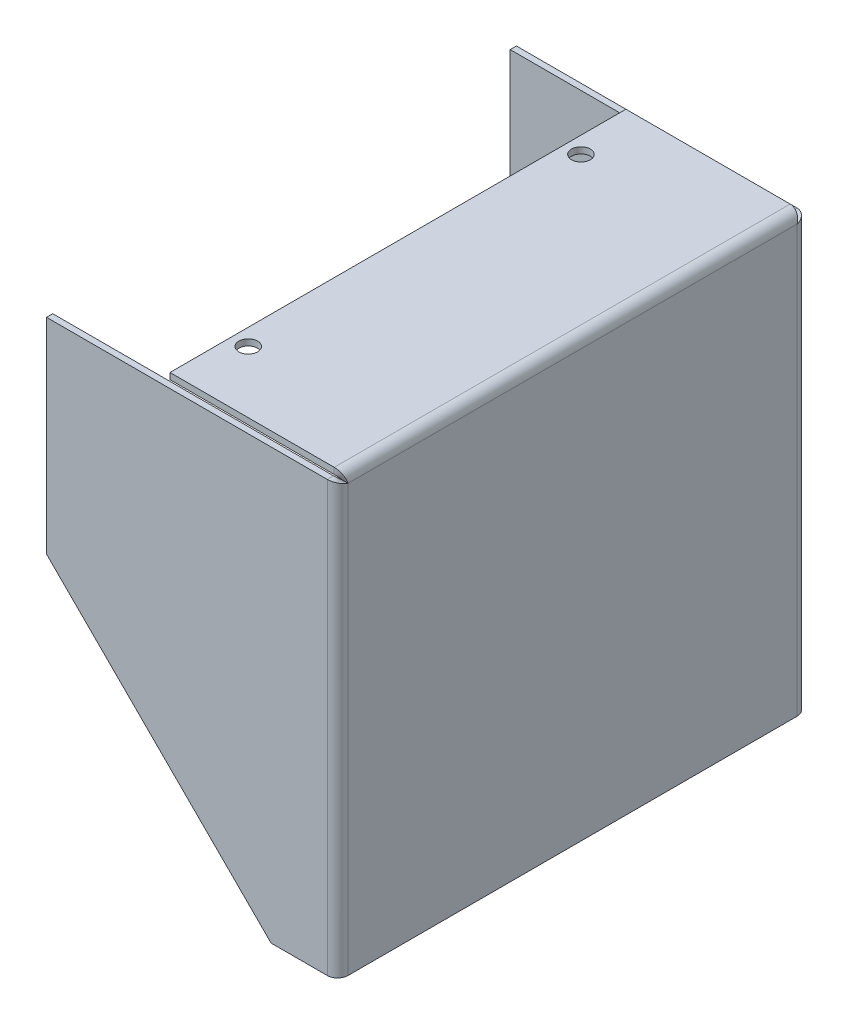
ISO-10303-21;
HEADER;
FILE_DESCRIPTION(('STEP AP214'),'2;1');
FILE_NAME('part.step','',(''),(''),'','','');
FILE_SCHEMA(('AUTOMOTIVE_DESIGN { 1 0 10303 214 1 1 1 1 }'));
ENDSEC;
DATA;
#1=APPLICATION_CONTEXT('core data for automotive mechanical design processes');
#2=APPLICATION_PROTOCOL_DEFINITION('international standard','automotive_design',2000,#1);
#3=PRODUCT_CONTEXT('',#1,'mechanical');
#4=PRODUCT('Part','Part','',(#3));
#5=PRODUCT_RELATED_PRODUCT_CATEGORY('part','',(#4));
#6=PRODUCT_DEFINITION_FORMATION('','',#4);
#7=PRODUCT_DEFINITION_CONTEXT('part definition',#1,'design');
#8=PRODUCT_DEFINITION('design','',#6,#7);
#9=PRODUCT_DEFINITION_SHAPE('','',#8);
#10=(LENGTH_UNIT() NAMED_UNIT(*) SI_UNIT(.MILLI.,.METRE.));
#11=(NAMED_UNIT(*) PLANE_ANGLE_UNIT() SI_UNIT($,.RADIAN.));
#12=(NAMED_UNIT(*) SI_UNIT($,.STERADIAN.) SOLID_ANGLE_UNIT());
#13=UNCERTAINTY_MEASURE_WITH_UNIT(LENGTH_MEASURE(1.E-05),#10,'distance_accuracy_value','');
#14=(GEOMETRIC_REPRESENTATION_CONTEXT(3) GLOBAL_UNCERTAINTY_ASSIGNED_CONTEXT((#13)) GLOBAL_UNIT_ASSIGNED_CONTEXT((#10,
#11,#12)) REPRESENTATION_CONTEXT('',''));
#15=CARTESIAN_POINT('',(0.,0.,0.));
#16=DIRECTION('',(0.,0.,1.));
#17=DIRECTION('',(1.,0.,0.));
#18=AXIS2_PLACEMENT_3D('',#15,#16,#17);
#19=CARTESIAN_POINT('',(-1.5,-52.5,56.5));
#20=DIRECTION('',(0.,-1.,0.));
#21=DIRECTION('',(0.,0.,-1.));
#22=AXIS2_PLACEMENT_3D('',#19,#20,#21);
#23=PLANE('',#22);
#24=DIRECTION('',(0.,0.,-1.));
#25=VECTOR('',#24,1.);
#26=CARTESIAN_POINT('',(-1.5,-52.5,56.5));
#27=LINE('',#26,#25);
#28=CARTESIAN_POINT('',(-1.5,-52.5000000000182,54.));
#29=VERTEX_POINT('',#28);
#30=CARTESIAN_POINT('',(-1.5,-52.5,-54.0000000000015));
#31=VERTEX_POINT('',#30);
#32=EDGE_CURVE('E272',#29,#31,#27,.T.);
#33=ORIENTED_EDGE('',*,*,#32,.T.);
#34=DIRECTION('',(1.,0.,0.));
#35=VECTOR('',#34,1.);
#36=CARTESIAN_POINT('',(0.,-52.5,-54.0000000000015));
#37=LINE('',#36,#35);
#38=CARTESIAN_POINT('',(0.,-52.5,-54.0000000000015));
#39=VERTEX_POINT('',#38);
#40=EDGE_CURVE('E515',#39,#31,#37,.F.);
#41=ORIENTED_EDGE('',*,*,#40,.F.);
#42=DIRECTION('',(0.,0.,-1.));
#43=VECTOR('',#42,1.);
#44=CARTESIAN_POINT('',(0.,-52.5,56.5));
#45=LINE('',#44,#43);
#46=CARTESIAN_POINT('',(0.,-52.5,54.));
#47=VERTEX_POINT('',#46);
#48=EDGE_CURVE('E269',#47,#39,#45,.T.);
#49=ORIENTED_EDGE('',*,*,#48,.F.);
#50=DIRECTION('',(1.,0.,0.));
#51=VECTOR('',#50,1.);
#52=CARTESIAN_POINT('',(0.,-52.5000000000182,54.));
#53=LINE('',#52,#51);
#54=EDGE_CURVE('E237',#47,#29,#53,.F.);
#55=ORIENTED_EDGE('',*,*,#54,.T.);
#56=EDGE_LOOP('',(#33,#41,#49,#55));
#57=FACE_BOUND('',#56,.T.);
#58=ADVANCED_FACE('F37',(#57),#23,.T.);
#59=CARTESIAN_POINT('',(-1.5,0.,0.));
#60=DIRECTION('',(-1.,0.,0.));
#61=DIRECTION('',(0.,0.,1.));
#62=AXIS2_PLACEMENT_3D('',#59,#60,#61);
#63=PLANE('',#62);
#64=DIRECTION('',(0.,0.,-1.));
#65=VECTOR('',#64,1.);
#66=CARTESIAN_POINT('',(-1.5,50.,56.5));
#67=LINE('',#66,#65);
#68=CARTESIAN_POINT('',(-1.5,49.9999999999863,54.));
#69=VERTEX_POINT('',#68);
#70=CARTESIAN_POINT('',(-1.5,50.0000000000016,-53.9999999999899));
#71=VERTEX_POINT('',#70);
#72=EDGE_CURVE('E206',#69,#71,#67,.T.);
#73=ORIENTED_EDGE('',*,*,#72,.T.);
#74=DIRECTION('',(0.,-1.,0.));
#75=VECTOR('',#74,1.);
#76=CARTESIAN_POINT('',(-1.5,52.5000000000015,-53.9999999999985));
#77=LINE('',#76,#75);
#78=EDGE_CURVE('E518',#71,#31,#77,.T.);
#79=ORIENTED_EDGE('',*,*,#78,.T.);
#80=ORIENTED_EDGE('',*,*,#32,.F.);
#81=DIRECTION('',(0.,1.,0.));
#82=VECTOR('',#81,1.);
#83=CARTESIAN_POINT('',(-1.5,-617.5,54.));
#84=LINE('',#83,#82);
#85=EDGE_CURVE('E220',#29,#69,#84,.T.);
#86=ORIENTED_EDGE('',*,*,#85,.T.);
#87=EDGE_LOOP('',(#73,#79,#80,#86));
#88=FACE_BOUND('',#87,.T.);
#89=ADVANCED_FACE('F323',(#88),#63,.T.);
#90=CARTESIAN_POINT('',(0.,0.,0.));
#91=DIRECTION('',(-1.,0.,0.));
#92=DIRECTION('',(0.,0.,1.));
#93=AXIS2_PLACEMENT_3D('',#90,#91,#92);
#94=PLANE('',#93);
#95=DIRECTION('',(0.,-1.,0.));
#96=VECTOR('',#95,1.);
#97=CARTESIAN_POINT('',(0.,52.5000000000015,-53.9999999999985));
#98=LINE('',#97,#96);
#99=CARTESIAN_POINT('',(0.,49.9999999999907,-53.9999999999986));
#100=VERTEX_POINT('',#99);
#101=EDGE_CURVE('E509',#100,#39,#98,.T.);
#102=ORIENTED_EDGE('',*,*,#101,.F.);
#103=DIRECTION('',(0.,0.,-1.));
#104=VECTOR('',#103,1.);
#105=CARTESIAN_POINT('',(0.,50.,56.5));
#106=LINE('',#105,#104);
#107=CARTESIAN_POINT('',(0.,50.,53.9999999999853));
#108=VERTEX_POINT('',#107);
#109=EDGE_CURVE('E201',#108,#100,#106,.T.);
#110=ORIENTED_EDGE('',*,*,#109,.F.);
#111=DIRECTION('',(0.,1.,0.));
#112=VECTOR('',#111,1.);
#113=CARTESIAN_POINT('',(0.,-617.5,54.));
#114=LINE('',#113,#112);
#115=EDGE_CURVE('E212',#47,#108,#114,.T.);
#116=ORIENTED_EDGE('',*,*,#115,.F.);
#117=ORIENTED_EDGE('',*,*,#48,.T.);
#118=EDGE_LOOP('',(#102,#110,#116,#117));
#119=FACE_BOUND('',#118,.T.);
#120=ADVANCED_FACE('F329',(#119),#94,.F.);
#121=CARTESIAN_POINT('',(-70.,-52.5,56.5));
#122=DIRECTION('',(1.,0.,0.));
#123=DIRECTION('',(0.,1.,0.));
#124=AXIS2_PLACEMENT_3D('',#121,#122,#123);
#125=PLANE('',#124);
#126=DIRECTION('',(0.,1.,0.));
#127=VECTOR('',#126,1.);
#128=CARTESIAN_POINT('',(-70.,-52.5,55.));
#129=LINE('',#128,#127);
#130=CARTESIAN_POINT('',(-70.,1.50000000000001,55.));
#131=VERTEX_POINT('',#130);
#132=CARTESIAN_POINT('',(-70.,50.8232233047199,55.));
#133=VERTEX_POINT('',#132);
#134=EDGE_CURVE('E249',#131,#133,#129,.T.);
#135=ORIENTED_EDGE('',*,*,#134,.F.);
#136=DIRECTION('',(0.,0.,1.));
#137=VECTOR('',#136,1.);
#138=CARTESIAN_POINT('',(-70.,1.50000000000001,56.5));
#139=LINE('',#138,#137);
#140=CARTESIAN_POINT('',(-70.,1.5,56.5));
#141=VERTEX_POINT('',#140);
#142=EDGE_CURVE('E45',#131,#141,#139,.T.);
#143=ORIENTED_EDGE('',*,*,#142,.T.);
#144=DIRECTION('',(0.,1.,0.));
#145=VECTOR('',#144,1.);
#146=CARTESIAN_POINT('',(-70.,-52.5,56.5));
#147=LINE('',#146,#145);
#148=CARTESIAN_POINT('',(-70.,50.8232233047199,56.5));
#149=VERTEX_POINT('',#148);
#150=EDGE_CURVE('E240',#141,#149,#147,.T.);
#151=ORIENTED_EDGE('',*,*,#150,.T.);
#152=DIRECTION('',(0.,0.,1.));
#153=VECTOR('',#152,1.);
#154=CARTESIAN_POINT('',(-70.,50.8232233047199,56.5));
#155=LINE('',#154,#153);
#156=EDGE_CURVE('E266',#149,#133,#155,.F.);
#157=ORIENTED_EDGE('',*,*,#156,.T.);
#158=EDGE_LOOP('',(#135,#143,#151,#157));
#159=FACE_BOUND('',#158,.T.);
#160=ADVANCED_FACE('F334',(#159),#125,.F.);
#161=CARTESIAN_POINT('',(-70.,-52.5,56.5));
#162=DIRECTION('',(0.,-1.,0.));
#163=DIRECTION('',(1.,0.,0.));
#164=AXIS2_PLACEMENT_3D('',#161,#162,#163);
#165=PLANE('',#164);
#166=DIRECTION('',(1.,0.,0.));
#167=VECTOR('',#166,1.);
#168=CARTESIAN_POINT('',(-70.,-52.5,56.5));
#169=LINE('',#168,#167);
#170=CARTESIAN_POINT('',(-16.,-52.5,56.5));
#171=VERTEX_POINT('',#170);
#172=CARTESIAN_POINT('',(-2.5,-52.5000000000182,56.5));
#173=VERTEX_POINT('',#172);
#174=EDGE_CURVE('E258',#171,#173,#169,.T.);
#175=ORIENTED_EDGE('',*,*,#174,.F.);
#176=DIRECTION('',(0.,0.,1.));
#177=VECTOR('',#176,1.);
#178=CARTESIAN_POINT('',(-16.,-52.5,56.5));
#179=LINE('',#178,#177);
#180=CARTESIAN_POINT('',(-16.,-52.5,55.));
#181=VERTEX_POINT('',#180);
#182=EDGE_CURVE('E286',#171,#181,#179,.F.);
#183=ORIENTED_EDGE('',*,*,#182,.T.);
#184=DIRECTION('',(1.,0.,0.));
#185=VECTOR('',#184,1.);
#186=CARTESIAN_POINT('',(-70.,-52.5,55.));
#187=LINE('',#186,#185);
#188=CARTESIAN_POINT('',(-2.5,-52.5000000000182,55.));
#189=VERTEX_POINT('',#188);
#190=EDGE_CURVE('E247',#181,#189,#187,.T.);
#191=ORIENTED_EDGE('',*,*,#190,.T.);
#192=DIRECTION('',(0.,0.,1.));
#193=VECTOR('',#192,1.);
#194=CARTESIAN_POINT('',(-2.5,-52.5,56.5));
#195=LINE('',#194,#193);
#196=EDGE_CURVE('E263',#173,#189,#195,.F.);
#197=ORIENTED_EDGE('',*,*,#196,.F.);
#198=EDGE_LOOP('',(#175,#183,#191,#197));
#199=FACE_BOUND('',#198,.T.);
#200=ADVANCED_FACE('F292',(#199),#165,.T.);
#201=CARTESIAN_POINT('',(-70.,50.8232233047199,56.5));
#202=DIRECTION('',(0.,-1.,0.));
#203=DIRECTION('',(1.,0.,0.));
#204=AXIS2_PLACEMENT_3D('',#201,#202,#203);
#205=PLANE('',#204);
#206=DIRECTION('',(1.,0.,0.));
#207=VECTOR('',#206,1.);
#208=CARTESIAN_POINT('',(-70.,50.8232233047199,56.5));
#209=LINE('',#208,#207);
#210=CARTESIAN_POINT('',(-2.5,50.8232233047199,56.5));
#211=VERTEX_POINT('',#210);
#212=EDGE_CURVE('E251',#211,#149,#209,.F.);
#213=ORIENTED_EDGE('',*,*,#212,.F.);
#214=DIRECTION('',(0.,0.,1.));
#215=VECTOR('',#214,1.);
#216=CARTESIAN_POINT('',(-2.5,50.8232233047199,56.5));
#217=LINE('',#216,#215);
#218=CARTESIAN_POINT('',(-2.5,50.8232233047061,55.));
#219=VERTEX_POINT('',#218);
#220=EDGE_CURVE('E254',#211,#219,#217,.F.);
#221=ORIENTED_EDGE('',*,*,#220,.T.);
#222=DIRECTION('',(1.,0.,0.));
#223=VECTOR('',#222,1.);
#224=CARTESIAN_POINT('',(-70.,50.8232233047199,55.));
#225=LINE('',#224,#223);
#226=EDGE_CURVE('E246',#219,#133,#225,.F.);
#227=ORIENTED_EDGE('',*,*,#226,.T.);
#228=ORIENTED_EDGE('',*,*,#156,.F.);
#229=EDGE_LOOP('',(#213,#221,#227,#228));
#230=FACE_BOUND('',#229,.T.);
#231=ADVANCED_FACE('F337',(#230),#205,.F.);
#232=CARTESIAN_POINT('',(-70.,-52.5,55.));
#233=DIRECTION('',(0.,0.,1.));
#234=DIRECTION('',(1.,0.,0.));
#235=AXIS2_PLACEMENT_3D('',#232,#233,#234);
#236=PLANE('',#235);
#237=ORIENTED_EDGE('',*,*,#190,.F.);
#238=DIRECTION('',(-0.707106781186548,0.707106781186548,0.));
#239=VECTOR('',#238,1.);
#240=CARTESIAN_POINT('',(-16.,-52.5,55.));
#241=LINE('',#240,#239);
#242=EDGE_CURVE('E59',#181,#131,#241,.T.);
#243=ORIENTED_EDGE('',*,*,#242,.T.);
#244=ORIENTED_EDGE('',*,*,#134,.T.);
#245=ORIENTED_EDGE('',*,*,#226,.F.);
#246=DIRECTION('',(0.,1.,0.));
#247=VECTOR('',#246,1.);
#248=CARTESIAN_POINT('',(-2.5,-52.5,55.));
#249=LINE('',#248,#247);
#250=EDGE_CURVE('E243',#189,#219,#249,.T.);
#251=ORIENTED_EDGE('',*,*,#250,.F.);
#252=EDGE_LOOP('',(#237,#243,#244,#245,#251));
#253=FACE_BOUND('',#252,.T.);
#254=ADVANCED_FACE('F298',(#253),#236,.F.);
#255=CARTESIAN_POINT('',(-70.,-52.5,56.5));
#256=DIRECTION('',(0.,0.,1.));
#257=DIRECTION('',(1.,0.,0.));
#258=AXIS2_PLACEMENT_3D('',#255,#256,#257);
#259=PLANE('',#258);
#260=ORIENTED_EDGE('',*,*,#150,.F.);
#261=DIRECTION('',(0.707106781186548,-0.707106781186548,0.));
#262=VECTOR('',#261,1.);
#263=CARTESIAN_POINT('',(-43.,-25.5,56.5));
#264=LINE('',#263,#262);
#265=EDGE_CURVE('E11',#141,#171,#264,.T.);
#266=ORIENTED_EDGE('',*,*,#265,.T.);
#267=ORIENTED_EDGE('',*,*,#174,.T.);
#268=DIRECTION('',(0.,1.,0.));
#269=VECTOR('',#268,1.);
#270=CARTESIAN_POINT('',(-2.5,-52.5,56.5));
#271=LINE('',#270,#269);
#272=EDGE_CURVE('E255',#173,#211,#271,.T.);
#273=ORIENTED_EDGE('',*,*,#272,.T.);
#274=ORIENTED_EDGE('',*,*,#212,.T.);
#275=EDGE_LOOP('',(#260,#266,#267,#273,#274));
#276=FACE_BOUND('',#275,.T.);
#277=ADVANCED_FACE('F313',(#276),#259,.T.);
#278=CARTESIAN_POINT('',(-2.5,-52.5000000000091,54.));
#279=DIRECTION('',(0.,1.,-3.64153152077051E-12));
#280=DIRECTION('',(0.,3.64153152077051E-12,1.));
#281=AXIS2_PLACEMENT_3D('',#278,#279,#280);
#282=PLANE('',#281);
#283=ORIENTED_EDGE('',*,*,#196,.T.);
#284=CARTESIAN_POINT('',(-2.5,-52.5000000000182,54.));
#285=DIRECTION('',(0.,1.,0.));
#286=DIRECTION('',(0.,0.,1.));
#287=AXIS2_PLACEMENT_3D('',#284,#285,#286);
#288=CIRCLE('',#287,1.);
#289=EDGE_CURVE('E223',#189,#29,#288,.T.);
#290=ORIENTED_EDGE('',*,*,#289,.T.);
#291=ORIENTED_EDGE('',*,*,#54,.F.);
#292=CARTESIAN_POINT('',(-2.5,-52.5000000000091,54.));
#293=DIRECTION('',(0.,-1.,3.64153152077051E-12));
#294=DIRECTION('',(0.,-3.64153152077051E-12,-1.));
#295=AXIS2_PLACEMENT_3D('',#292,#293,#294);
#296=CIRCLE('',#295,2.5);
#297=EDGE_CURVE('E232',#173,#47,#296,.F.);
#298=ORIENTED_EDGE('',*,*,#297,.F.);
#299=EDGE_LOOP('',(#283,#290,#291,#298));
#300=FACE_BOUND('',#299,.T.);
#301=ADVANCED_FACE('F305',(#300),#282,.F.);
#302=CARTESIAN_POINT('',(-2.5,50.8232233047061,56.5));
#303=CARTESIAN_POINT('',(-2.5,50.8232233047061,56.));
#304=CARTESIAN_POINT('',(-2.5,50.8232233047061,55.5));
#305=CARTESIAN_POINT('',(-2.5,50.8232233047061,55.));
#306=CARTESIAN_POINT('',(-7.5,50.8232233047061,56.5));
#307=CARTESIAN_POINT('',(-6.5,50.8232233047061,56.));
#308=CARTESIAN_POINT('',(-5.5,50.8232233047061,55.5));
#309=CARTESIAN_POINT('',(-4.5,50.8232233047061,55.));
#310=CARTESIAN_POINT('',(-7.5,49.1767766952664,51.5));
#311=CARTESIAN_POINT('',(-6.5,49.1767766952664,52.));
#312=CARTESIAN_POINT('',(-5.5,49.1767766952664,52.5));
#313=CARTESIAN_POINT('',(-4.5,49.1767766952664,53.));
#314=CARTESIAN_POINT('',(-2.5,49.1767766952664,51.5));
#315=CARTESIAN_POINT('',(-2.5,49.1767766952664,52.));
#316=CARTESIAN_POINT('',(-2.5,49.1767766952664,52.5));
#317=CARTESIAN_POINT('',(-2.5,49.1767766952664,53.));
#318=CARTESIAN_POINT('',(2.5,49.1767766952664,51.5));
#319=CARTESIAN_POINT('',(1.5,49.1767766952664,52.));
#320=CARTESIAN_POINT('',(0.499999999999998,49.1767766952664,52.5));
#321=CARTESIAN_POINT('',(-0.500000000000002,49.1767766952664,53.));
#322=CARTESIAN_POINT('',(2.5,50.8232233047061,56.5));
#323=CARTESIAN_POINT('',(1.5,50.8232233047061,56.));
#324=CARTESIAN_POINT('',(0.499999999999998,50.8232233047061,55.5));
#325=CARTESIAN_POINT('',(-0.500000000000002,50.8232233047061,55.));
#326=CARTESIAN_POINT('',(-2.5,50.8232233047061,56.5));
#327=CARTESIAN_POINT('',(-2.5,50.8232233047061,56.));
#328=CARTESIAN_POINT('',(-2.5,50.8232233047061,55.5));
#329=CARTESIAN_POINT('',(-2.5,50.8232233047061,55.));
#330=(BOUNDED_SURFACE() B_SPLINE_SURFACE(3,3,((#302,#303,#304,#305),(#306,#307,#308,#309),(#310,
#311,#312,#313),(#314,#315,#316,#317),(#318,#319,#320,#321),(#322,#323,#324,#325),(#326,#327,
#328,#329)),.UNSPECIFIED.,.T.,.F.,.F.) B_SPLINE_SURFACE_WITH_KNOTS((4,3,4),(4,4),(0.,0.5,1.),
(0.,1.),.UNSPECIFIED.) GEOMETRIC_REPRESENTATION_ITEM() RATIONAL_B_SPLINE_SURFACE(((1.,1.,1.,1.),
(0.333333333333333,0.333333333333333,0.333333333333333,0.333333333333333),(0.333333333333333,
0.333333333333333,0.333333333333333,0.333333333333333),(1.,1.,1.,1.),(0.333333333333333,
0.333333333333333,0.333333333333333,0.333333333333333),(0.333333333333333,0.333333333333333,
0.333333333333333,0.333333333333333),(1.,1.,1.,1.))) REPRESENTATION_ITEM('') SURFACE());
#331=CARTESIAN_POINT('',(-2.5,49.9999999999863,54.));
#332=DIRECTION('',(0.,0.949829335558922,-0.312768657815478));
#333=DIRECTION('',(0.,0.312768657815478,0.949829335558923));
#334=AXIS2_PLACEMENT_3D('',#331,#332,#333);
#335=ELLIPSE('',#334,2.63205178699696,2.5);
#336=EDGE_CURVE('E224',#108,#211,#335,.F.);
#337=DIRECTION('',(1.,0.,0.));
#338=VECTOR('',#337,1.);
#339=CARTESIAN_POINT('',(0.,49.9999999999863,54.));
#340=LINE('',#339,#338);
#341=EDGE_CURVE('E229',#108,#69,#340,.F.);
#342=CARTESIAN_POINT('',(-2.5,49.9999999999863,54.));
#343=DIRECTION('',(0.,0.772046194420234,-0.635566419567015));
#344=DIRECTION('',(0.,0.635566419567015,0.772046194420234));
#345=AXIS2_PLACEMENT_3D('',#342,#343,#344);
#346=ELLIPSE('',#345,1.29525928270516,1.);
#347=EDGE_CURVE('E227',#69,#219,#346,.F.);
#348=ORIENTED_EDGE('',*,*,#336,.F.);
#349=ORIENTED_EDGE('',*,*,#341,.T.);
#350=ORIENTED_EDGE('',*,*,#347,.T.);
#351=ORIENTED_EDGE('',*,*,#220,.F.);
#352=EDGE_LOOP('',(#348,#349,#350,#351));
#353=FACE_BOUND('',#352,.T.);
#354=ADVANCED_FACE('F349',(#353),#330,.F.);
#355=CARTESIAN_POINT('',(-2.5,-617.5,54.));
#356=DIRECTION('',(0.,1.,0.));
#357=DIRECTION('',(0.,0.,1.));
#358=AXIS2_PLACEMENT_3D('',#355,#356,#357);
#359=CYLINDRICAL_SURFACE('',#358,1.);
#360=ORIENTED_EDGE('',*,*,#85,.F.);
#361=ORIENTED_EDGE('',*,*,#289,.F.);
#362=ORIENTED_EDGE('',*,*,#250,.T.);
#363=ORIENTED_EDGE('',*,*,#347,.F.);
#364=EDGE_LOOP('',(#360,#361,#362,#363));
#365=FACE_BOUND('',#364,.T.);
#366=ADVANCED_FACE('F302',(#365),#359,.F.);
#367=CARTESIAN_POINT('',(-2.5,-617.5,54.));
#368=DIRECTION('',(0.,1.,0.));
#369=DIRECTION('',(0.,0.,1.));
#370=AXIS2_PLACEMENT_3D('',#367,#368,#369);
#371=CYLINDRICAL_SURFACE('',#370,2.5);
#372=ORIENTED_EDGE('',*,*,#115,.T.);
#373=ORIENTED_EDGE('',*,*,#336,.T.);
#374=ORIENTED_EDGE('',*,*,#272,.F.);
#375=ORIENTED_EDGE('',*,*,#297,.T.);
#376=EDGE_LOOP('',(#372,#373,#374,#375));
#377=FACE_BOUND('',#376,.T.);
#378=ADVANCED_FACE('F309',(#377),#371,.T.);
#379=CARTESIAN_POINT('',(-70.,52.500000000008,54.8232233046694));
#380=DIRECTION('',(0.,0.,1.));
#381=DIRECTION('',(1.,0.,0.));
#382=AXIS2_PLACEMENT_3D('',#379,#380,#381);
#383=PLANE('',#382);
#384=DIRECTION('',(1.,0.,0.));
#385=VECTOR('',#384,1.);
#386=CARTESIAN_POINT('',(-70.,52.500000000008,54.8232233046694));
#387=LINE('',#386,#385);
#388=CARTESIAN_POINT('',(-42.,52.500000000008,54.8232233046694));
#389=VERTEX_POINT('',#388);
#390=CARTESIAN_POINT('',(-2.5,52.5,54.8232233046521));
#391=VERTEX_POINT('',#390);
#392=EDGE_CURVE('E185',#389,#391,#387,.T.);
#393=ORIENTED_EDGE('',*,*,#392,.F.);
#394=DIRECTION('',(0.,1.,0.));
#395=VECTOR('',#394,1.);
#396=CARTESIAN_POINT('',(-42.,-52.5010000000198,54.8232233046679));
#397=LINE('',#396,#395);
#398=CARTESIAN_POINT('',(-42.,51.000000000008,54.8232233046694));
#399=VERTEX_POINT('',#398);
#400=EDGE_CURVE('E165',#399,#389,#397,.T.);
#401=ORIENTED_EDGE('',*,*,#400,.F.);
#402=DIRECTION('',(1.,0.,0.));
#403=VECTOR('',#402,1.);
#404=CARTESIAN_POINT('',(-70.,51.000000000008,54.8232233046694));
#405=LINE('',#404,#403);
#406=CARTESIAN_POINT('',(-2.5,51.,54.8232233046521));
#407=VERTEX_POINT('',#406);
#408=EDGE_CURVE('E195',#399,#407,#405,.T.);
#409=ORIENTED_EDGE('',*,*,#408,.T.);
#410=DIRECTION('',(0.,1.,0.));
#411=VECTOR('',#410,1.);
#412=CARTESIAN_POINT('',(-2.5,52.500000000008,54.8232233046694));
#413=LINE('',#412,#411);
#414=EDGE_CURVE('E187',#391,#407,#413,.F.);
#415=ORIENTED_EDGE('',*,*,#414,.F.);
#416=EDGE_LOOP('',(#393,#401,#409,#415));
#417=FACE_BOUND('',#416,.T.);
#418=ADVANCED_FACE('F364',(#417),#383,.T.);
#419=CARTESIAN_POINT('',(-70.,52.5000000000095,-54.8232233047059));
#420=DIRECTION('',(0.,0.,1.));
#421=DIRECTION('',(1.,0.,0.));
#422=AXIS2_PLACEMENT_3D('',#419,#420,#421);
#423=PLANE('',#422);
#424=DIRECTION('',(1.,0.,0.));
#425=VECTOR('',#424,1.);
#426=CARTESIAN_POINT('',(-70.,51.0000000000095,-54.8232233047059));
#427=LINE('',#426,#425);
#428=CARTESIAN_POINT('',(-2.5,51.0000000000016,-54.8232233046927));
#429=VERTEX_POINT('',#428);
#430=CARTESIAN_POINT('',(-42.,51.0000000000087,-54.8232233047059));
#431=VERTEX_POINT('',#430);
#432=EDGE_CURVE('E179',#429,#431,#427,.F.);
#433=ORIENTED_EDGE('',*,*,#432,.T.);
#434=DIRECTION('',(0.,1.,0.));
#435=VECTOR('',#434,1.);
#436=CARTESIAN_POINT('',(-42.,-52.5010000000182,-54.8232233047074));
#437=LINE('',#436,#435);
#438=CARTESIAN_POINT('',(-42.,52.5000000000095,-54.8232233047059));
#439=VERTEX_POINT('',#438);
#440=EDGE_CURVE('E162',#431,#439,#437,.T.);
#441=ORIENTED_EDGE('',*,*,#440,.T.);
#442=DIRECTION('',(1.,0.,0.));
#443=VECTOR('',#442,1.);
#444=CARTESIAN_POINT('',(-70.,52.5000000000095,-54.8232233047059));
#445=LINE('',#444,#443);
#446=CARTESIAN_POINT('',(-2.5,52.5000000000095,-54.8232233047059));
#447=VERTEX_POINT('',#446);
#448=EDGE_CURVE('E176',#447,#439,#445,.F.);
#449=ORIENTED_EDGE('',*,*,#448,.F.);
#450=DIRECTION('',(0.,1.,0.));
#451=VECTOR('',#450,1.);
#452=CARTESIAN_POINT('',(-2.5,52.5000000000095,-54.8232233047059));
#453=LINE('',#452,#451);
#454=EDGE_CURVE('E194',#447,#429,#453,.F.);
#455=ORIENTED_EDGE('',*,*,#454,.T.);
#456=EDGE_LOOP('',(#433,#441,#449,#455));
#457=FACE_BOUND('',#456,.T.);
#458=ADVANCED_FACE('F174',(#457),#423,.F.);
#459=CARTESIAN_POINT('',(-70.,51.,621.5));
#460=DIRECTION('',(0.,1.,0.));
#461=DIRECTION('',(1.,0.,0.));
#462=AXIS2_PLACEMENT_3D('',#459,#460,#461);
#463=PLANE('',#462);
#464=CARTESIAN_POINT('',(-38.,51.0000000000093,-39.9999999999993));
#465=DIRECTION('',(0.,1.,0.));
#466=DIRECTION('',(0.,0.,1.));
#467=AXIS2_PLACEMENT_3D('',#464,#465,#466);
#468=CIRCLE('',#467,2.25);
#469=CARTESIAN_POINT('',(-38.,51.0000000000093,-37.7499999999993));
#470=VERTEX_POINT('',#469);
#471=EDGE_CURVE('E465',#470,#470,#468,.T.);
#472=ORIENTED_EDGE('',*,*,#471,.T.);
#473=EDGE_LOOP('',(#472));
#474=FACE_BOUND('',#473,.T.);
#475=CARTESIAN_POINT('',(-38.,51.0000000000082,40.0000000000007));
#476=DIRECTION('',(0.,1.,0.));
#477=DIRECTION('',(0.,0.,1.));
#478=AXIS2_PLACEMENT_3D('',#475,#476,#477);
#479=CIRCLE('',#478,2.25);
#480=CARTESIAN_POINT('',(-38.,51.0000000000081,42.2500000000007));
#481=VERTEX_POINT('',#480);
#482=EDGE_CURVE('E475',#481,#481,#479,.T.);
#483=ORIENTED_EDGE('',*,*,#482,.T.);
#484=EDGE_LOOP('',(#483));
#485=FACE_BOUND('',#484,.T.);
#486=ORIENTED_EDGE('',*,*,#408,.F.);
#487=DIRECTION('',(0.,0.,1.));
#488=VECTOR('',#487,1.);
#489=CARTESIAN_POINT('',(-42.,51.0000000000095,-54.8232233047059));
#490=LINE('',#489,#488);
#491=EDGE_CURVE('E169',#431,#399,#490,.T.);
#492=ORIENTED_EDGE('',*,*,#491,.F.);
#493=ORIENTED_EDGE('',*,*,#432,.F.);
#494=DIRECTION('',(0.,0.,-1.));
#495=VECTOR('',#494,1.);
#496=CARTESIAN_POINT('',(-2.5,51.,621.5));
#497=LINE('',#496,#495);
#498=EDGE_CURVE('E198',#407,#429,#497,.T.);
#499=ORIENTED_EDGE('',*,*,#498,.F.);
#500=EDGE_LOOP('',(#486,#492,#493,#499));
#501=FACE_BOUND('',#500,.T.);
#502=ADVANCED_FACE('F393',(#474,#485,#501),#463,.F.);
#503=CARTESIAN_POINT('',(-70.,52.5,621.5));
#504=DIRECTION('',(0.,1.,0.));
#505=DIRECTION('',(1.,0.,0.));
#506=AXIS2_PLACEMENT_3D('',#503,#504,#505);
#507=PLANE('',#506);
#508=CARTESIAN_POINT('',(-38.,52.5000000000093,-39.9999999999993));
#509=DIRECTION('',(0.,1.,0.));
#510=DIRECTION('',(0.,0.,1.));
#511=AXIS2_PLACEMENT_3D('',#508,#509,#510);
#512=CIRCLE('',#511,2.24999999999999);
#513=CARTESIAN_POINT('',(-38.,52.5000000000093,-37.7499999999993));
#514=VERTEX_POINT('',#513);
#515=EDGE_CURVE('E468',#514,#514,#512,.T.);
#516=ORIENTED_EDGE('',*,*,#515,.F.);
#517=EDGE_LOOP('',(#516));
#518=FACE_BOUND('',#517,.T.);
#519=CARTESIAN_POINT('',(-38.,52.5000000000082,40.0000000000007));
#520=DIRECTION('',(0.,1.,0.));
#521=DIRECTION('',(0.,0.,1.));
#522=AXIS2_PLACEMENT_3D('',#519,#520,#521);
#523=CIRCLE('',#522,2.24999999999999);
#524=CARTESIAN_POINT('',(-38.,52.5000000000081,42.2500000000007));
#525=VERTEX_POINT('',#524);
#526=EDGE_CURVE('E470',#525,#525,#523,.T.);
#527=ORIENTED_EDGE('',*,*,#526,.F.);
#528=EDGE_LOOP('',(#527));
#529=FACE_BOUND('',#528,.T.);
#530=DIRECTION('',(0.,0.,-1.));
#531=VECTOR('',#530,1.);
#532=CARTESIAN_POINT('',(-42.,52.5000000000095,-54.8232233047059));
#533=LINE('',#532,#531);
#534=EDGE_CURVE('E159',#389,#439,#533,.T.);
#535=ORIENTED_EDGE('',*,*,#534,.F.);
#536=ORIENTED_EDGE('',*,*,#392,.T.);
#537=DIRECTION('',(0.,0.,-1.));
#538=VECTOR('',#537,1.);
#539=CARTESIAN_POINT('',(-2.5,52.5,621.5));
#540=LINE('',#539,#538);
#541=EDGE_CURVE('E184',#391,#447,#540,.T.);
#542=ORIENTED_EDGE('',*,*,#541,.T.);
#543=ORIENTED_EDGE('',*,*,#448,.T.);
#544=EDGE_LOOP('',(#535,#536,#542,#543));
#545=FACE_BOUND('',#544,.T.);
#546=ADVANCED_FACE('F182',(#518,#529,#545),#507,.T.);
#547=CARTESIAN_POINT('',(-2.5,47.5000000000001,53.1767766953186));
#548=CARTESIAN_POINT('',(-2.5,48.0000000000001,53.1767766953186));
#549=CARTESIAN_POINT('',(-2.5,48.5000000000001,53.1767766953186));
#550=CARTESIAN_POINT('',(-2.5,49.0000000000001,53.1767766953186));
#551=CARTESIAN_POINT('',(-7.5,47.5000000000001,53.1767766953186));
#552=CARTESIAN_POINT('',(-6.5,48.0000000000001,53.1767766953186));
#553=CARTESIAN_POINT('',(-5.5,48.5000000000001,53.1767766953186));
#554=CARTESIAN_POINT('',(-4.5,49.0000000000001,53.1767766953186));
#555=CARTESIAN_POINT('',(-7.5,52.5,54.8232233046521));
#556=CARTESIAN_POINT('',(-6.5,52.,54.8232233046521));
#557=CARTESIAN_POINT('',(-5.5,51.5,54.8232233046521));
#558=CARTESIAN_POINT('',(-4.5,51.,54.8232233046521));
#559=CARTESIAN_POINT('',(-2.5,52.5,54.8232233046521));
#560=CARTESIAN_POINT('',(-2.5,52.,54.8232233046521));
#561=CARTESIAN_POINT('',(-2.5,51.5,54.8232233046521));
#562=CARTESIAN_POINT('',(-2.5,51.,54.8232233046521));
#563=CARTESIAN_POINT('',(2.5,52.5,54.8232233046521));
#564=CARTESIAN_POINT('',(1.5,52.,54.8232233046521));
#565=CARTESIAN_POINT('',(0.499999999999999,51.5,54.8232233046521));
#566=CARTESIAN_POINT('',(-0.500000000000002,51.,54.8232233046521));
#567=CARTESIAN_POINT('',(2.5,47.5000000000001,53.1767766953186));
#568=CARTESIAN_POINT('',(1.5,48.0000000000001,53.1767766953186));
#569=CARTESIAN_POINT('',(0.499999999999997,48.5000000000001,53.1767766953186));
#570=CARTESIAN_POINT('',(-0.500000000000003,49.0000000000001,53.1767766953186));
#571=CARTESIAN_POINT('',(-2.5,47.5000000000001,53.1767766953186));
#572=CARTESIAN_POINT('',(-2.5,48.0000000000001,53.1767766953186));
#573=CARTESIAN_POINT('',(-2.5,48.5000000000001,53.1767766953186));
#574=CARTESIAN_POINT('',(-2.5,49.0000000000001,53.1767766953186));
#575=(BOUNDED_SURFACE() B_SPLINE_SURFACE(3,3,((#547,#548,#549,#550),(#551,#552,#553,#554),(#555,
#556,#557,#558),(#559,#560,#561,#562),(#563,#564,#565,#566),(#567,#568,#569,#570),(#571,#572,
#573,#574)),.UNSPECIFIED.,.T.,.F.,.F.) B_SPLINE_SURFACE_WITH_KNOTS((4,3,4),(4,4),(0.,0.5,1.),
(0.,1.),.UNSPECIFIED.) GEOMETRIC_REPRESENTATION_ITEM() RATIONAL_B_SPLINE_SURFACE(((1.,1.,1.,1.),
(0.333333333333333,0.333333333333333,0.333333333333333,0.333333333333333),(0.333333333333333,
0.333333333333333,0.333333333333333,0.333333333333333),(1.,1.,1.,1.),(0.333333333333333,
0.333333333333333,0.333333333333333,0.333333333333333),(0.333333333333333,0.333333333333333,
0.333333333333333,0.333333333333333),(1.,1.,1.,1.))) REPRESENTATION_ITEM('') SURFACE());
#576=CARTESIAN_POINT('',(-2.5,50.,53.9999999999853));
#577=DIRECTION('',(0.,-0.63556641954257,0.772046194440357));
#578=DIRECTION('',(0.,-0.772046194440357,-0.63556641954257));
#579=AXIS2_PLACEMENT_3D('',#576,#577,#578);
#580=ELLIPSE('',#579,1.29525928267138,1.);
#581=EDGE_CURVE('E216',#407,#69,#580,.F.);
#582=CARTESIAN_POINT('',(-2.5,50.,53.9999999999853));
#583=DIRECTION('',(0.,-0.312768657797271,0.949829335564918));
#584=DIRECTION('',(0.,-0.949829335564918,-0.312768657797271));
#585=AXIS2_PLACEMENT_3D('',#582,#583,#584);
#586=ELLIPSE('',#585,2.63205178698034,2.5);
#587=EDGE_CURVE('E210',#391,#108,#586,.F.);
#588=ORIENTED_EDGE('',*,*,#414,.T.);
#589=ORIENTED_EDGE('',*,*,#581,.T.);
#590=ORIENTED_EDGE('',*,*,#341,.F.);
#591=ORIENTED_EDGE('',*,*,#587,.F.);
#592=EDGE_LOOP('',(#588,#589,#590,#591));
#593=FACE_BOUND('',#592,.T.);
#594=ADVANCED_FACE('F377',(#593),#575,.F.);
#595=CARTESIAN_POINT('',(-2.5,52.5000000000016,-54.8232233046926));
#596=CARTESIAN_POINT('',(-2.5,52.0000000000016,-54.8232233046926));
#597=CARTESIAN_POINT('',(-2.5,51.5000000000016,-54.8232233046926));
#598=CARTESIAN_POINT('',(-2.5,51.0000000000016,-54.8232233046927));
#599=CARTESIAN_POINT('',(-7.5,52.5000000000016,-54.8232233046926));
#600=CARTESIAN_POINT('',(-6.5,52.0000000000016,-54.8232233046927));
#601=CARTESIAN_POINT('',(-5.5,51.5000000000016,-54.8232233046927));
#602=CARTESIAN_POINT('',(-4.5,51.0000000000016,-54.8232233046927));
#603=CARTESIAN_POINT('',(-7.5,47.5000000000016,-53.1767766952871));
#604=CARTESIAN_POINT('',(-6.5,48.0000000000016,-53.1767766952871));
#605=CARTESIAN_POINT('',(-5.5,48.5000000000016,-53.1767766952871));
#606=CARTESIAN_POINT('',(-4.5,49.0000000000016,-53.1767766952871));
#607=CARTESIAN_POINT('',(-2.5,47.5000000000016,-53.1767766952871));
#608=CARTESIAN_POINT('',(-2.5,48.0000000000016,-53.1767766952871));
#609=CARTESIAN_POINT('',(-2.5,48.5000000000016,-53.1767766952871));
#610=CARTESIAN_POINT('',(-2.5,49.0000000000016,-53.1767766952871));
#611=CARTESIAN_POINT('',(2.5,47.5000000000016,-53.1767766952871));
#612=CARTESIAN_POINT('',(1.5,48.0000000000016,-53.1767766952871));
#613=CARTESIAN_POINT('',(0.499999999999999,48.5000000000016,-53.1767766952871));
#614=CARTESIAN_POINT('',(-0.500000000000002,49.0000000000016,-53.1767766952871));
#615=CARTESIAN_POINT('',(2.5,52.5000000000016,-54.8232233046926));
#616=CARTESIAN_POINT('',(1.5,52.0000000000016,-54.8232233046927));
#617=CARTESIAN_POINT('',(0.499999999999999,51.5000000000016,-54.8232233046927));
#618=CARTESIAN_POINT('',(-0.500000000000002,51.0000000000016,-54.8232233046927));
#619=CARTESIAN_POINT('',(-2.5,52.5000000000016,-54.8232233046926));
#620=CARTESIAN_POINT('',(-2.5,52.0000000000016,-54.8232233046926));
#621=CARTESIAN_POINT('',(-2.5,51.5000000000016,-54.8232233046926));
#622=CARTESIAN_POINT('',(-2.5,51.0000000000016,-54.8232233046927));
#623=(BOUNDED_SURFACE() B_SPLINE_SURFACE(3,3,((#595,#596,#597,#598),(#599,#600,#601,#602),(#603,
#604,#605,#606),(#607,#608,#609,#610),(#611,#612,#613,#614),(#615,#616,#617,#618),(#619,#620,
#621,#622)),.UNSPECIFIED.,.T.,.F.,.F.) B_SPLINE_SURFACE_WITH_KNOTS((4,3,4),(4,4),(0.,0.5,1.),
(0.,1.),.UNSPECIFIED.) GEOMETRIC_REPRESENTATION_ITEM() RATIONAL_B_SPLINE_SURFACE(((1.,1.,1.,1.),
(0.333333333333333,0.333333333333333,0.333333333333333,0.333333333333333),(0.333333333333333,
0.333333333333333,0.333333333333333,0.333333333333333),(1.,1.,1.,1.),(0.333333333333333,
0.333333333333333,0.333333333333333,0.333333333333333),(0.333333333333333,0.333333333333333,
0.333333333333333,0.333333333333333),(1.,1.,1.,1.))) REPRESENTATION_ITEM('') SURFACE());
#624=CARTESIAN_POINT('',(-2.5,50.0000000000016,-53.9999999999899));
#625=DIRECTION('',(0.,-0.312768657809613,-0.949829335560854));
#626=DIRECTION('',(0.,0.949829335560854,-0.312768657809613));
#627=AXIS2_PLACEMENT_3D('',#624,#625,#626);
#628=ELLIPSE('',#627,2.63205178699162,2.5);
#629=EDGE_CURVE('E207',#100,#447,#628,.F.);
#630=DIRECTION('',(1.,0.,0.));
#631=VECTOR('',#630,1.);
#632=CARTESIAN_POINT('',(0.,50.0000000000016,-53.9999999999899));
#633=LINE('',#632,#631);
#634=EDGE_CURVE('E203',#100,#71,#633,.F.);
#635=CARTESIAN_POINT('',(-2.5,50.0000000000016,-53.9999999999899));
#636=DIRECTION('',(0.,-0.635566419559155,-0.772046194426704));
#637=DIRECTION('',(0.,0.772046194426704,-0.635566419559155));
#638=AXIS2_PLACEMENT_3D('',#635,#636,#637);
#639=ELLIPSE('',#638,1.29525928269432,1.);
#640=EDGE_CURVE('E202',#71,#429,#639,.F.);
#641=ORIENTED_EDGE('',*,*,#629,.F.);
#642=ORIENTED_EDGE('',*,*,#634,.T.);
#643=ORIENTED_EDGE('',*,*,#640,.T.);
#644=ORIENTED_EDGE('',*,*,#454,.F.);
#645=EDGE_LOOP('',(#641,#642,#643,#644));
#646=FACE_BOUND('',#645,.T.);
#647=ADVANCED_FACE('F371',(#646),#623,.F.);
#648=CARTESIAN_POINT('',(-2.5,50.,56.5));
#649=DIRECTION('',(0.,0.,-1.));
#650=DIRECTION('',(0.,1.,0.));
#651=AXIS2_PLACEMENT_3D('',#648,#649,#650);
#652=CYLINDRICAL_SURFACE('',#651,1.);
#653=ORIENTED_EDGE('',*,*,#72,.F.);
#654=ORIENTED_EDGE('',*,*,#581,.F.);
#655=ORIENTED_EDGE('',*,*,#498,.T.);
#656=ORIENTED_EDGE('',*,*,#640,.F.);
#657=EDGE_LOOP('',(#653,#654,#655,#656));
#658=FACE_BOUND('',#657,.T.);
#659=ADVANCED_FACE('F367',(#658),#652,.F.);
#660=CARTESIAN_POINT('',(-2.5,50.,56.5));
#661=DIRECTION('',(0.,0.,-1.));
#662=DIRECTION('',(0.,1.,0.));
#663=AXIS2_PLACEMENT_3D('',#660,#661,#662);
#664=CYLINDRICAL_SURFACE('',#663,2.5);
#665=ORIENTED_EDGE('',*,*,#109,.T.);
#666=ORIENTED_EDGE('',*,*,#629,.T.);
#667=ORIENTED_EDGE('',*,*,#541,.F.);
#668=ORIENTED_EDGE('',*,*,#587,.T.);
#669=EDGE_LOOP('',(#665,#666,#667,#668));
#670=FACE_BOUND('',#669,.T.);
#671=ADVANCED_FACE('F370',(#670),#664,.T.);
#672=CARTESIAN_POINT('',(-70.,-52.5,-56.5000000000173));
#673=DIRECTION('',(0.,1.,0.));
#674=DIRECTION('',(1.,0.,0.));
#675=AXIS2_PLACEMENT_3D('',#672,#673,#674);
#676=PLANE('',#675);
#677=DIRECTION('',(1.,0.,0.));
#678=VECTOR('',#677,1.);
#679=CARTESIAN_POINT('',(-70.,-52.5,-55.0000000000173));
#680=LINE('',#679,#678);
#681=CARTESIAN_POINT('',(-2.5,-52.5,-55.0000000000015));
#682=VERTEX_POINT('',#681);
#683=CARTESIAN_POINT('',(-16.,-52.5,-55.0000000000173));
#684=VERTEX_POINT('',#683);
#685=EDGE_CURVE('E492',#682,#684,#680,.F.);
#686=ORIENTED_EDGE('',*,*,#685,.T.);
#687=DIRECTION('',(0.,0.,-1.));
#688=VECTOR('',#687,1.);
#689=CARTESIAN_POINT('',(-16.,-52.5,-56.5000000000173));
#690=LINE('',#689,#688);
#691=CARTESIAN_POINT('',(-16.,-52.5,-56.5000000000173));
#692=VERTEX_POINT('',#691);
#693=EDGE_CURVE('E282',#684,#692,#690,.T.);
#694=ORIENTED_EDGE('',*,*,#693,.T.);
#695=DIRECTION('',(1.,0.,0.));
#696=VECTOR('',#695,1.);
#697=CARTESIAN_POINT('',(-70.,-52.5,-56.5000000000173));
#698=LINE('',#697,#696);
#699=CARTESIAN_POINT('',(-2.5,-52.5,-56.5000000000173));
#700=VERTEX_POINT('',#699);
#701=EDGE_CURVE('E489',#700,#692,#698,.F.);
#702=ORIENTED_EDGE('',*,*,#701,.F.);
#703=DIRECTION('',(0.,0.,-1.));
#704=VECTOR('',#703,1.);
#705=CARTESIAN_POINT('',(-2.5,-52.5,-56.5000000000173));
#706=LINE('',#705,#704);
#707=EDGE_CURVE('E180',#700,#682,#706,.F.);
#708=ORIENTED_EDGE('',*,*,#707,.T.);
#709=EDGE_LOOP('',(#686,#694,#702,#708));
#710=FACE_BOUND('',#709,.T.);
#711=ADVANCED_FACE('F375',(#710),#676,.F.);
#712=CARTESIAN_POINT('',(-70.,617.500000000002,-56.4999999999985));
#713=DIRECTION('',(1.,0.,0.));
#714=DIRECTION('',(0.,-1.,0.));
#715=AXIS2_PLACEMENT_3D('',#712,#713,#714);
#716=PLANE('',#715);
#717=DIRECTION('',(0.,-1.,0.));
#718=VECTOR('',#717,1.);
#719=CARTESIAN_POINT('',(-70.,617.500000000002,-56.4999999999985));
#720=LINE('',#719,#718);
#721=CARTESIAN_POINT('',(-70.,50.8232233047594,-56.5000000000144));
#722=VERTEX_POINT('',#721);
#723=CARTESIAN_POINT('',(-70.,1.50000000000014,-56.5000000000158));
#724=VERTEX_POINT('',#723);
#725=EDGE_CURVE('E484',#722,#724,#720,.T.);
#726=ORIENTED_EDGE('',*,*,#725,.T.);
#727=DIRECTION('',(0.,0.,1.));
#728=VECTOR('',#727,1.);
#729=CARTESIAN_POINT('',(-70.,1.50000000000006,-56.5000000000158));
#730=LINE('',#729,#728);
#731=CARTESIAN_POINT('',(-70.,1.50000000000005,-55.0000000000158));
#732=VERTEX_POINT('',#731);
#733=EDGE_CURVE('E275',#724,#732,#730,.T.);
#734=ORIENTED_EDGE('',*,*,#733,.T.);
#735=DIRECTION('',(0.,-1.,0.));
#736=VECTOR('',#735,1.);
#737=CARTESIAN_POINT('',(-70.,617.500000000002,-54.9999999999985));
#738=LINE('',#737,#736);
#739=CARTESIAN_POINT('',(-70.,50.8232233047594,-55.0000000000144));
#740=VERTEX_POINT('',#739);
#741=EDGE_CURVE('E497',#740,#732,#738,.T.);
#742=ORIENTED_EDGE('',*,*,#741,.F.);
#743=DIRECTION('',(0.,0.,-1.));
#744=VECTOR('',#743,1.);
#745=CARTESIAN_POINT('',(-70.,50.8232233047594,-56.5000000000144));
#746=LINE('',#745,#744);
#747=EDGE_CURVE('E480',#722,#740,#746,.F.);
#748=ORIENTED_EDGE('',*,*,#747,.F.);
#749=EDGE_LOOP('',(#726,#734,#742,#748));
#750=FACE_BOUND('',#749,.T.);
#751=ADVANCED_FACE('F442',(#750),#716,.F.);
#752=CARTESIAN_POINT('',(-70.,50.8232233047594,-56.5000000000144));
#753=DIRECTION('',(0.,1.,0.));
#754=DIRECTION('',(1.,0.,0.));
#755=AXIS2_PLACEMENT_3D('',#752,#753,#754);
#756=PLANE('',#755);
#757=DIRECTION('',(1.,0.,0.));
#758=VECTOR('',#757,1.);
#759=CARTESIAN_POINT('',(-70.,50.8232233047594,-56.5000000000144));
#760=LINE('',#759,#758);
#761=CARTESIAN_POINT('',(-2.5,50.8232233047453,-56.4999999999986));
#762=VERTEX_POINT('',#761);
#763=EDGE_CURVE('E493',#722,#762,#760,.T.);
#764=ORIENTED_EDGE('',*,*,#763,.F.);
#765=ORIENTED_EDGE('',*,*,#747,.T.);
#766=DIRECTION('',(1.,0.,0.));
#767=VECTOR('',#766,1.);
#768=CARTESIAN_POINT('',(-70.,50.8232233047594,-55.0000000000144));
#769=LINE('',#768,#767);
#770=CARTESIAN_POINT('',(-2.5,50.8232233047453,-54.9999999999986));
#771=VERTEX_POINT('',#770);
#772=EDGE_CURVE('E483',#740,#771,#769,.T.);
#773=ORIENTED_EDGE('',*,*,#772,.T.);
#774=DIRECTION('',(0.,0.,-1.));
#775=VECTOR('',#774,1.);
#776=CARTESIAN_POINT('',(-2.5,50.8232233047594,-56.5000000000144));
#777=LINE('',#776,#775);
#778=EDGE_CURVE('E485',#762,#771,#777,.F.);
#779=ORIENTED_EDGE('',*,*,#778,.F.);
#780=EDGE_LOOP('',(#764,#765,#773,#779));
#781=FACE_BOUND('',#780,.T.);
#782=ADVANCED_FACE('F437',(#781),#756,.T.);
#783=CARTESIAN_POINT('',(-70.,617.500000000002,-54.9999999999985));
#784=DIRECTION('',(0.,0.,-1.));
#785=DIRECTION('',(1.,0.,0.));
#786=AXIS2_PLACEMENT_3D('',#783,#784,#785);
#787=PLANE('',#786);
#788=ORIENTED_EDGE('',*,*,#741,.T.);
#789=DIRECTION('',(-0.707106781186547,0.707106781186548,0.));
#790=VECTOR('',#789,1.);
#791=CARTESIAN_POINT('',(-70.,1.50000000000001,-55.0000000000158));
#792=LINE('',#791,#790);
#793=EDGE_CURVE('E280',#732,#684,#792,.F.);
#794=ORIENTED_EDGE('',*,*,#793,.T.);
#795=ORIENTED_EDGE('',*,*,#685,.F.);
#796=DIRECTION('',(0.,-1.,0.));
#797=VECTOR('',#796,1.);
#798=CARTESIAN_POINT('',(-2.5,617.500000000002,-54.9999999999985));
#799=LINE('',#798,#797);
#800=EDGE_CURVE('E506',#771,#682,#799,.T.);
#801=ORIENTED_EDGE('',*,*,#800,.F.);
#802=ORIENTED_EDGE('',*,*,#772,.F.);
#803=EDGE_LOOP('',(#788,#794,#795,#801,#802));
#804=FACE_BOUND('',#803,.T.);
#805=ADVANCED_FACE('F434',(#804),#787,.F.);
#806=CARTESIAN_POINT('',(-70.,617.500000000002,-56.4999999999985));
#807=DIRECTION('',(0.,0.,-1.));
#808=DIRECTION('',(1.,0.,0.));
#809=AXIS2_PLACEMENT_3D('',#806,#807,#808);
#810=PLANE('',#809);
#811=ORIENTED_EDGE('',*,*,#701,.T.);
#812=DIRECTION('',(0.707106781186547,-0.707106781186548,0.));
#813=VECTOR('',#812,1.);
#814=CARTESIAN_POINT('',(-378.000000000001,309.500000000001,-56.5000000000072));
#815=LINE('',#814,#813);
#816=EDGE_CURVE('E284',#692,#724,#815,.F.);
#817=ORIENTED_EDGE('',*,*,#816,.T.);
#818=ORIENTED_EDGE('',*,*,#725,.F.);
#819=ORIENTED_EDGE('',*,*,#763,.T.);
#820=DIRECTION('',(0.,-1.,0.));
#821=VECTOR('',#820,1.);
#822=CARTESIAN_POINT('',(-2.5,617.500000000002,-56.4999999999985));
#823=LINE('',#822,#821);
#824=EDGE_CURVE('E496',#762,#700,#823,.T.);
#825=ORIENTED_EDGE('',*,*,#824,.T.);
#826=EDGE_LOOP('',(#811,#817,#818,#819,#825));
#827=FACE_BOUND('',#826,.T.);
#828=ADVANCED_FACE('F424',(#827),#810,.T.);
#829=CARTESIAN_POINT('',(-2.5,49.176776695236,-51.4999999999986));
#830=CARTESIAN_POINT('',(-2.5,49.1767766952361,-51.9999999999986));
#831=CARTESIAN_POINT('',(-2.5,49.1767766952361,-52.4999999999986));
#832=CARTESIAN_POINT('',(-2.5,49.1767766952361,-52.9999999999986));
#833=CARTESIAN_POINT('',(-7.5,49.176776695236,-51.4999999999986));
#834=CARTESIAN_POINT('',(-6.5,49.1767766952361,-51.9999999999986));
#835=CARTESIAN_POINT('',(-5.5,49.1767766952361,-52.4999999999986));
#836=CARTESIAN_POINT('',(-4.5,49.1767766952361,-52.9999999999986));
#837=CARTESIAN_POINT('',(-7.5,50.8232233047453,-56.4999999999986));
#838=CARTESIAN_POINT('',(-6.5,50.8232233047453,-55.9999999999986));
#839=CARTESIAN_POINT('',(-5.5,50.8232233047453,-55.4999999999986));
#840=CARTESIAN_POINT('',(-4.5,50.8232233047453,-54.9999999999986));
#841=CARTESIAN_POINT('',(-2.5,50.8232233047453,-56.4999999999986));
#842=CARTESIAN_POINT('',(-2.5,50.8232233047453,-55.9999999999986));
#843=CARTESIAN_POINT('',(-2.5,50.8232233047453,-55.4999999999986));
#844=CARTESIAN_POINT('',(-2.5,50.8232233047453,-54.9999999999986));
#845=CARTESIAN_POINT('',(2.5,50.8232233047453,-56.4999999999986));
#846=CARTESIAN_POINT('',(1.5,50.8232233047453,-55.9999999999986));
#847=CARTESIAN_POINT('',(0.499999999999999,50.8232233047453,-55.4999999999986));
#848=CARTESIAN_POINT('',(-0.500000000000002,50.8232233047453,-54.9999999999986));
#849=CARTESIAN_POINT('',(2.5,49.176776695236,-51.4999999999986));
#850=CARTESIAN_POINT('',(1.5,49.1767766952361,-51.9999999999986));
#851=CARTESIAN_POINT('',(0.499999999999999,49.1767766952361,-52.4999999999986));
#852=CARTESIAN_POINT('',(-0.500000000000002,49.1767766952361,-52.9999999999986));
#853=CARTESIAN_POINT('',(-2.5,49.176776695236,-51.4999999999986));
#854=CARTESIAN_POINT('',(-2.5,49.1767766952361,-51.9999999999986));
#855=CARTESIAN_POINT('',(-2.5,49.1767766952361,-52.4999999999986));
#856=CARTESIAN_POINT('',(-2.5,49.1767766952361,-52.9999999999986));
#857=(BOUNDED_SURFACE() B_SPLINE_SURFACE(3,3,((#829,#830,#831,#832),(#833,#834,#835,#836),(#837,
#838,#839,#840),(#841,#842,#843,#844),(#845,#846,#847,#848),(#849,#850,#851,#852),(#853,#854,
#855,#856)),.UNSPECIFIED.,.T.,.F.,.F.) B_SPLINE_SURFACE_WITH_KNOTS((4,3,4),(4,4),(0.,0.5,1.),
(0.,1.),.UNSPECIFIED.) GEOMETRIC_REPRESENTATION_ITEM() RATIONAL_B_SPLINE_SURFACE(((1.,1.,1.,1.),
(0.333333333333333,0.333333333333333,0.333333333333333,0.333333333333333),(0.333333333333333,
0.333333333333333,0.333333333333333,0.333333333333333),(1.,1.,1.,1.),(0.333333333333333,
0.333333333333333,0.333333333333333,0.333333333333333),(0.333333333333333,0.333333333333333,
0.333333333333333,0.333333333333333),(1.,1.,1.,1.))) REPRESENTATION_ITEM('') SURFACE());
#858=CARTESIAN_POINT('',(-2.5,49.9999999999907,-53.9999999999986));
#859=DIRECTION('',(0.,0.772046194407066,0.635566419583011));
#860=DIRECTION('',(0.,-0.635566419583011,0.772046194407066));
#861=AXIS2_PLACEMENT_3D('',#858,#859,#860);
#862=ELLIPSE('',#861,1.29525928272723,1.);
#863=EDGE_CURVE('E488',#771,#71,#862,.F.);
#864=CARTESIAN_POINT('',(-2.5,49.9999999999907,-53.9999999999986));
#865=DIRECTION('',(0.,0.949829335554997,0.312768657827399));
#866=DIRECTION('',(0.,-0.312768657827399,0.949829335554997));
#867=AXIS2_PLACEMENT_3D('',#864,#865,#866);
#868=ELLIPSE('',#867,2.63205178700782,2.5);
#869=EDGE_CURVE('E197',#762,#100,#868,.F.);
#870=ORIENTED_EDGE('',*,*,#778,.T.);
#871=ORIENTED_EDGE('',*,*,#863,.T.);
#872=ORIENTED_EDGE('',*,*,#634,.F.);
#873=ORIENTED_EDGE('',*,*,#869,.F.);
#874=EDGE_LOOP('',(#870,#871,#872,#873));
#875=FACE_BOUND('',#874,.T.);
#876=ADVANCED_FACE('F419',(#875),#857,.F.);
#877=CARTESIAN_POINT('',(-2.5,-52.5000000000091,-54.0000000000015));
#878=DIRECTION('',(0.,1.,3.64153152077051E-12));
#879=DIRECTION('',(0.,-3.64153152077051E-12,1.));
#880=AXIS2_PLACEMENT_3D('',#877,#878,#879);
#881=PLANE('',#880);
#882=CARTESIAN_POINT('',(-2.5,-52.5000000000091,-54.0000000000015));
#883=DIRECTION('',(0.,-1.,-3.64153152077051E-12));
#884=DIRECTION('',(0.,3.64153152077051E-12,-1.));
#885=AXIS2_PLACEMENT_3D('',#882,#883,#884);
#886=CIRCLE('',#885,2.5);
#887=EDGE_CURVE('E519',#39,#700,#886,.F.);
#888=ORIENTED_EDGE('',*,*,#887,.F.);
#889=ORIENTED_EDGE('',*,*,#40,.T.);
#890=CARTESIAN_POINT('',(-2.5,-52.5,-54.0000000000015));
#891=DIRECTION('',(0.,-1.,0.));
#892=DIRECTION('',(0.,0.,-1.));
#893=AXIS2_PLACEMENT_3D('',#890,#891,#892);
#894=CIRCLE('',#893,1.);
#895=EDGE_CURVE('E510',#31,#682,#894,.F.);
#896=ORIENTED_EDGE('',*,*,#895,.T.);
#897=ORIENTED_EDGE('',*,*,#707,.F.);
#898=EDGE_LOOP('',(#888,#889,#896,#897));
#899=FACE_BOUND('',#898,.T.);
#900=ADVANCED_FACE('F414',(#899),#881,.F.);
#901=CARTESIAN_POINT('',(-2.5,52.5000000000015,-53.9999999999985));
#902=DIRECTION('',(0.,-1.,0.));
#903=DIRECTION('',(0.,0.,-1.));
#904=AXIS2_PLACEMENT_3D('',#901,#902,#903);
#905=CYLINDRICAL_SURFACE('',#904,1.);
#906=ORIENTED_EDGE('',*,*,#78,.F.);
#907=ORIENTED_EDGE('',*,*,#863,.F.);
#908=ORIENTED_EDGE('',*,*,#800,.T.);
#909=ORIENTED_EDGE('',*,*,#895,.F.);
#910=EDGE_LOOP('',(#906,#907,#908,#909));
#911=FACE_BOUND('',#910,.T.);
#912=ADVANCED_FACE('F410',(#911),#905,.F.);
#913=CARTESIAN_POINT('',(-2.5,52.5000000000015,-53.9999999999985));
#914=DIRECTION('',(0.,-1.,0.));
#915=DIRECTION('',(0.,0.,-1.));
#916=AXIS2_PLACEMENT_3D('',#913,#914,#915);
#917=CYLINDRICAL_SURFACE('',#916,2.5);
#918=ORIENTED_EDGE('',*,*,#101,.T.);
#919=ORIENTED_EDGE('',*,*,#887,.T.);
#920=ORIENTED_EDGE('',*,*,#824,.F.);
#921=ORIENTED_EDGE('',*,*,#869,.T.);
#922=EDGE_LOOP('',(#918,#919,#920,#921));
#923=FACE_BOUND('',#922,.T.);
#924=ADVANCED_FACE('F413',(#923),#917,.T.);
#925=CARTESIAN_POINT('',(-42.,-52.5010000000182,-54.8232233047074));
#926=DIRECTION('',(1.,0.,0.));
#927=DIRECTION('',(0.,0.,-1.));
#928=AXIS2_PLACEMENT_3D('',#925,#926,#927);
#929=PLANE('',#928);
#930=ORIENTED_EDGE('',*,*,#491,.T.);
#931=ORIENTED_EDGE('',*,*,#400,.T.);
#932=ORIENTED_EDGE('',*,*,#534,.T.);
#933=ORIENTED_EDGE('',*,*,#440,.F.);
#934=EDGE_LOOP('',(#930,#931,#932,#933));
#935=FACE_BOUND('',#934,.T.);
#936=ADVANCED_FACE('F161',(#935),#929,.F.);
#937=CARTESIAN_POINT('',(-38.,52.5000000000082,40.0000000000007));
#938=DIRECTION('',(0.,1.,0.));
#939=DIRECTION('',(0.,0.,1.));
#940=AXIS2_PLACEMENT_3D('',#937,#938,#939);
#941=CYLINDRICAL_SURFACE('',#940,2.25);
#942=ORIENTED_EDGE('',*,*,#482,.F.);
#943=EDGE_LOOP('',(#942));
#944=FACE_BOUND('',#943,.T.);
#945=ORIENTED_EDGE('',*,*,#526,.T.);
#946=EDGE_LOOP('',(#945));
#947=FACE_BOUND('',#946,.T.);
#948=ADVANCED_FACE('F454',(#944,#947),#941,.F.);
#949=CARTESIAN_POINT('',(-38.,52.5000000000093,-39.9999999999993));
#950=DIRECTION('',(0.,1.,0.));
#951=DIRECTION('',(0.,0.,1.));
#952=AXIS2_PLACEMENT_3D('',#949,#950,#951);
#953=CYLINDRICAL_SURFACE('',#952,2.25);
#954=ORIENTED_EDGE('',*,*,#471,.F.);
#955=EDGE_LOOP('',(#954));
#956=FACE_BOUND('',#955,.T.);
#957=ORIENTED_EDGE('',*,*,#515,.T.);
#958=EDGE_LOOP('',(#957));
#959=FACE_BOUND('',#958,.T.);
#960=ADVANCED_FACE('F320',(#956,#959),#953,.F.);
#961=CARTESIAN_POINT('',(-70.,1.50000000000006,-56.5000000000158));
#962=DIRECTION('',(0.707106781186548,0.707106781186547,0.));
#963=DIRECTION('',(0.,0.,1.));
#964=AXIS2_PLACEMENT_3D('',#961,#962,#963);
#965=PLANE('',#964);
#966=ORIENTED_EDGE('',*,*,#816,.F.);
#967=ORIENTED_EDGE('',*,*,#693,.F.);
#968=ORIENTED_EDGE('',*,*,#793,.F.);
#969=ORIENTED_EDGE('',*,*,#733,.F.);
#970=EDGE_LOOP('',(#966,#967,#968,#969));
#971=FACE_BOUND('',#970,.T.);
#972=ADVANCED_FACE('F316',(#971),#965,.F.);
#973=CARTESIAN_POINT('',(-16.,-52.5,56.5));
#974=DIRECTION('',(-0.707106781186548,-0.707106781186548,0.));
#975=DIRECTION('',(0.,0.,1.));
#976=AXIS2_PLACEMENT_3D('',#973,#974,#975);
#977=PLANE('',#976);
#978=ORIENTED_EDGE('',*,*,#265,.F.);
#979=ORIENTED_EDGE('',*,*,#142,.F.);
#980=ORIENTED_EDGE('',*,*,#242,.F.);
#981=ORIENTED_EDGE('',*,*,#182,.F.);
#982=EDGE_LOOP('',(#978,#979,#980,#981));
#983=FACE_BOUND('',#982,.T.);
#984=ADVANCED_FACE('F39',(#983),#977,.T.);
#985=CLOSED_SHELL('',(#58,#89,#120,#160,#200,#231,#254,#277,#301,#354,#366,#378,#418,#458,#502,
#546,#594,#647,#659,#671,#711,#751,#782,#805,#828,#876,#900,#912,#924,#936,#948,#960,#972,#984));
#986=MANIFOLD_SOLID_BREP('B2',#985);
#987=ADVANCED_BREP_SHAPE_REPRESENTATION('',(#18,#986),#14);
#988=SHAPE_DEFINITION_REPRESENTATION(#9,#987);
ENDSEC;
END-ISO-10303-21;
